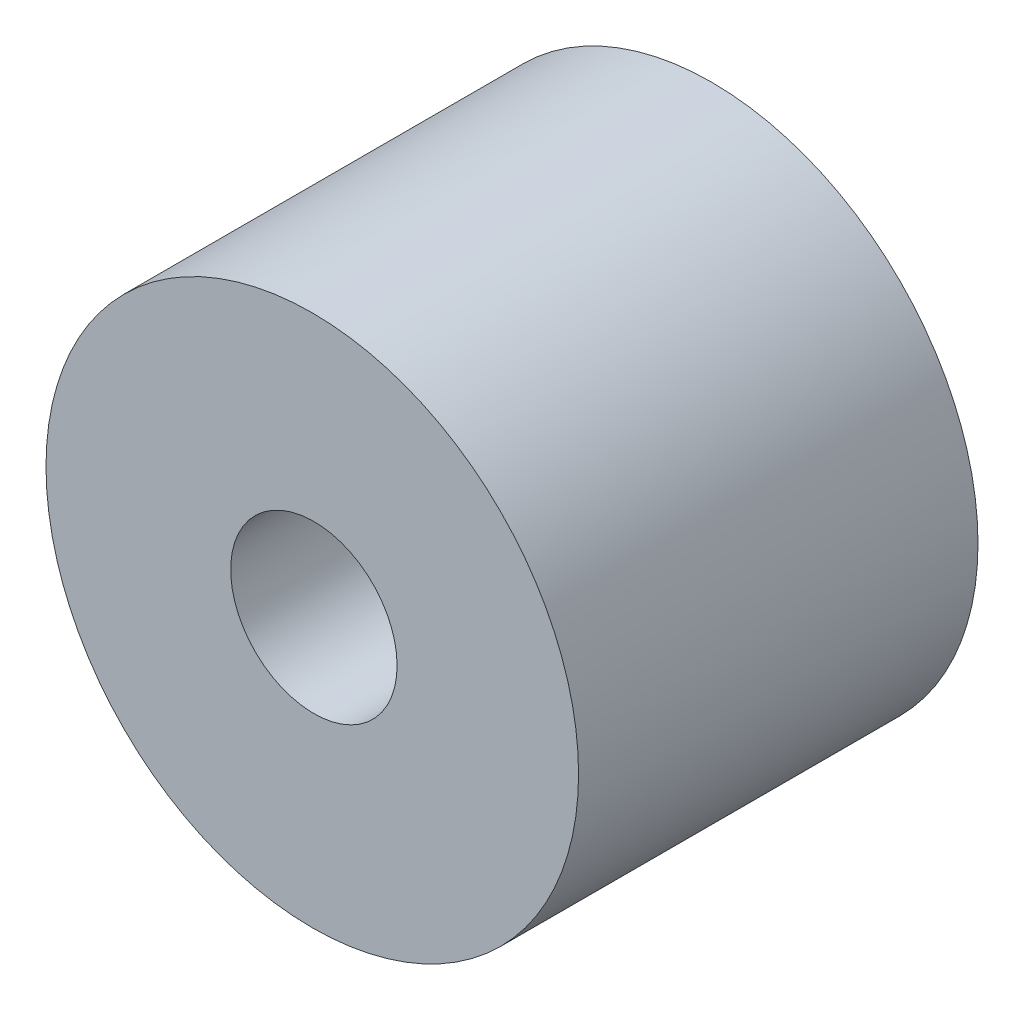
ISO-10303-21;
HEADER;
FILE_DESCRIPTION(('STEP AP214'),'2;1');
FILE_NAME('part.step','',(''),(''),'','','');
FILE_SCHEMA(('AUTOMOTIVE_DESIGN { 1 0 10303 214 1 1 1 1 }'));
ENDSEC;
DATA;
#1=APPLICATION_CONTEXT('core data for automotive mechanical design processes');
#2=APPLICATION_PROTOCOL_DEFINITION('international standard','automotive_design',2000,#1);
#3=PRODUCT_CONTEXT('',#1,'mechanical');
#4=PRODUCT('Part','Part','',(#3));
#5=PRODUCT_RELATED_PRODUCT_CATEGORY('part','',(#4));
#6=PRODUCT_DEFINITION_FORMATION('','',#4);
#7=PRODUCT_DEFINITION_CONTEXT('part definition',#1,'design');
#8=PRODUCT_DEFINITION('design','',#6,#7);
#9=PRODUCT_DEFINITION_SHAPE('','',#8);
#10=(LENGTH_UNIT() NAMED_UNIT(*) SI_UNIT(.MILLI.,.METRE.));
#11=(NAMED_UNIT(*) PLANE_ANGLE_UNIT() SI_UNIT($,.RADIAN.));
#12=(NAMED_UNIT(*) SI_UNIT($,.STERADIAN.) SOLID_ANGLE_UNIT());
#13=UNCERTAINTY_MEASURE_WITH_UNIT(LENGTH_MEASURE(1.E-05),#10,'distance_accuracy_value','');
#14=(GEOMETRIC_REPRESENTATION_CONTEXT(3) GLOBAL_UNCERTAINTY_ASSIGNED_CONTEXT((#13)) GLOBAL_UNIT_ASSIGNED_CONTEXT((#10,
#11,#12)) REPRESENTATION_CONTEXT('',''));
#15=CARTESIAN_POINT('',(0.,0.,0.));
#16=DIRECTION('',(0.,0.,1.));
#17=DIRECTION('',(1.,0.,0.));
#18=AXIS2_PLACEMENT_3D('',#15,#16,#17);
#19=CARTESIAN_POINT('',(1.94289029309402E-13,0.,12.));
#20=DIRECTION('',(0.,0.,-1.));
#21=DIRECTION('',(-1.,0.,0.));
#22=AXIS2_PLACEMENT_3D('',#19,#20,#21);
#23=CYLINDRICAL_SURFACE('',#22,8.);
#24=CARTESIAN_POINT('',(1.94289029309402E-13,0.,12.));
#25=DIRECTION('',(0.,0.,1.));
#26=DIRECTION('',(1.,0.,0.));
#27=AXIS2_PLACEMENT_3D('',#24,#25,#26);
#28=CIRCLE('',#27,8.);
#29=CARTESIAN_POINT('',(8.0000000000002,0.,12.));
#30=VERTEX_POINT('',#29);
#31=EDGE_CURVE('E12',#30,#30,#28,.T.);
#32=ORIENTED_EDGE('',*,*,#31,.F.);
#33=EDGE_LOOP('',(#32));
#34=FACE_BOUND('',#33,.T.);
#35=CARTESIAN_POINT('',(0.,0.,0.));
#36=DIRECTION('',(0.,0.,1.));
#37=DIRECTION('',(1.,0.,0.));
#38=AXIS2_PLACEMENT_3D('',#35,#36,#37);
#39=CIRCLE('',#38,8.);
#40=CARTESIAN_POINT('',(8.00000000000001,0.,0.));
#41=VERTEX_POINT('',#40);
#42=EDGE_CURVE('E53',#41,#41,#39,.T.);
#43=ORIENTED_EDGE('',*,*,#42,.T.);
#44=EDGE_LOOP('',(#43));
#45=FACE_BOUND('',#44,.T.);
#46=ADVANCED_FACE('F50',(#34,#45),#23,.T.);
#47=CARTESIAN_POINT('',(1.94289029309402E-13,0.,12.));
#48=DIRECTION('',(0.,0.,1.));
#49=DIRECTION('',(1.,0.,0.));
#50=AXIS2_PLACEMENT_3D('',#47,#48,#49);
#51=PLANE('',#50);
#52=CARTESIAN_POINT('',(0.0478390149965813,0.0964802368911832,11.9999999998868));
#53=DIRECTION('',(0.,0.,1.));
#54=DIRECTION('',(1.,0.,0.));
#55=AXIS2_PLACEMENT_3D('',#52,#53,#54);
#56=CIRCLE('',#55,2.5);
#57=CARTESIAN_POINT('',(2.54783901499658,0.0964802368911839,11.9999999998868));
#58=VERTEX_POINT('',#57);
#59=EDGE_CURVE('E65',#58,#58,#56,.T.);
#60=ORIENTED_EDGE('',*,*,#59,.F.);
#61=EDGE_LOOP('',(#60));
#62=FACE_BOUND('',#61,.T.);
#63=ORIENTED_EDGE('',*,*,#31,.T.);
#64=EDGE_LOOP('',(#63));
#65=FACE_BOUND('',#64,.T.);
#66=ADVANCED_FACE('F83',(#62,#65),#51,.T.);
#67=CARTESIAN_POINT('',(0.,0.,0.));
#68=DIRECTION('',(0.,0.,1.));
#69=DIRECTION('',(1.,0.,0.));
#70=AXIS2_PLACEMENT_3D('',#67,#68,#69);
#71=PLANE('',#70);
#72=ORIENTED_EDGE('',*,*,#42,.F.);
#73=EDGE_LOOP('',(#72));
#74=FACE_BOUND('',#73,.T.);
#75=ADVANCED_FACE('F79',(#74),#71,.F.);
#76=CARTESIAN_POINT('',(0.047839014996498,0.0964802368912387,6.99999999988676));
#77=DIRECTION('',(0.,0.,1.));
#78=DIRECTION('',(1.,0.,0.));
#79=AXIS2_PLACEMENT_3D('',#76,#77,#78);
#80=CYLINDRICAL_SURFACE('',#79,2.5);
#81=CARTESIAN_POINT('',(0.047839014996498,0.0964802368912387,6.99999999988676));
#82=DIRECTION('',(0.,0.,1.));
#83=DIRECTION('',(1.,0.,0.));
#84=AXIS2_PLACEMENT_3D('',#81,#82,#83);
#85=CIRCLE('',#84,2.5);
#86=CARTESIAN_POINT('',(2.5478390149965,0.0964802368912394,6.99999999988676));
#87=VERTEX_POINT('',#86);
#88=EDGE_CURVE('E63',#87,#87,#85,.T.);
#89=ORIENTED_EDGE('',*,*,#88,.F.);
#90=EDGE_LOOP('',(#89));
#91=FACE_BOUND('',#90,.T.);
#92=ORIENTED_EDGE('',*,*,#59,.T.);
#93=EDGE_LOOP('',(#92));
#94=FACE_BOUND('',#93,.T.);
#95=ADVANCED_FACE('F76',(#91,#94),#80,.F.);
#96=CARTESIAN_POINT('',(0.047839014996498,0.0964802368912387,6.99999999988676));
#97=DIRECTION('',(0.,0.,1.));
#98=DIRECTION('',(1.,0.,0.));
#99=AXIS2_PLACEMENT_3D('',#96,#97,#98);
#100=PLANE('',#99);
#101=ORIENTED_EDGE('',*,*,#88,.T.);
#102=EDGE_LOOP('',(#101));
#103=FACE_BOUND('',#102,.T.);
#104=ADVANCED_FACE('F74',(#103),#100,.T.);
#105=CLOSED_SHELL('',(#46,#66,#75,#95,#104));
#106=MANIFOLD_SOLID_BREP('B2',#105);
#107=ADVANCED_BREP_SHAPE_REPRESENTATION('',(#18,#106),#14);
#108=SHAPE_DEFINITION_REPRESENTATION(#9,#107);
ENDSEC;
END-ISO-10303-21;
